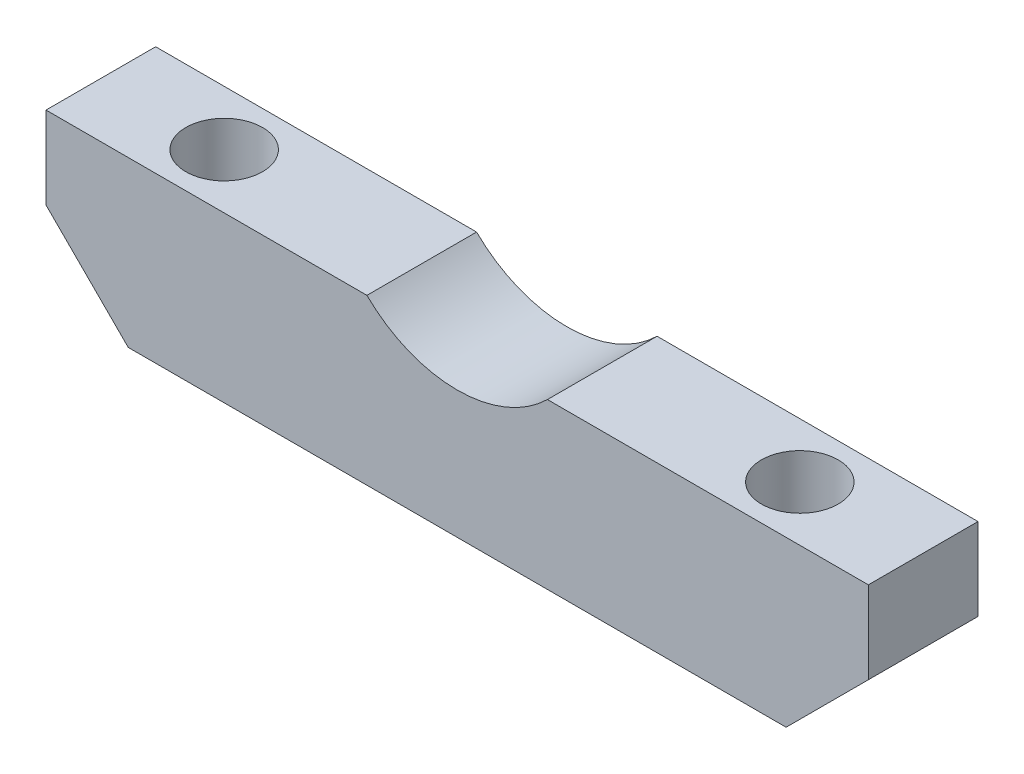
ISO-10303-21;
HEADER;
FILE_DESCRIPTION(('STEP AP214'),'2;1');
FILE_NAME('part.step','',(''),(''),'','','');
FILE_SCHEMA(('AUTOMOTIVE_DESIGN { 1 0 10303 214 1 1 1 1 }'));
ENDSEC;
DATA;
#1=APPLICATION_CONTEXT('core data for automotive mechanical design processes');
#2=APPLICATION_PROTOCOL_DEFINITION('international standard','automotive_design',2000,#1);
#3=PRODUCT_CONTEXT('',#1,'mechanical');
#4=PRODUCT('Part','Part','',(#3));
#5=PRODUCT_RELATED_PRODUCT_CATEGORY('part','',(#4));
#6=PRODUCT_DEFINITION_FORMATION('','',#4);
#7=PRODUCT_DEFINITION_CONTEXT('part definition',#1,'design');
#8=PRODUCT_DEFINITION('design','',#6,#7);
#9=PRODUCT_DEFINITION_SHAPE('','',#8);
#10=(LENGTH_UNIT() NAMED_UNIT(*) SI_UNIT(.MILLI.,.METRE.));
#11=(NAMED_UNIT(*) PLANE_ANGLE_UNIT() SI_UNIT($,.RADIAN.));
#12=(NAMED_UNIT(*) SI_UNIT($,.STERADIAN.) SOLID_ANGLE_UNIT());
#13=UNCERTAINTY_MEASURE_WITH_UNIT(LENGTH_MEASURE(1.E-05),#10,'distance_accuracy_value','');
#14=(GEOMETRIC_REPRESENTATION_CONTEXT(3) GLOBAL_UNCERTAINTY_ASSIGNED_CONTEXT((#13)) GLOBAL_UNIT_ASSIGNED_CONTEXT((#10,
#11,#12)) REPRESENTATION_CONTEXT('',''));
#15=CARTESIAN_POINT('',(0.,0.,0.));
#16=DIRECTION('',(0.,0.,1.));
#17=DIRECTION('',(1.,0.,0.));
#18=AXIS2_PLACEMENT_3D('',#15,#16,#17);
#19=CARTESIAN_POINT('',(-15.,6.5,4.));
#20=DIRECTION('',(0.,-1.,0.));
#21=DIRECTION('',(0.,0.,-1.));
#22=AXIS2_PLACEMENT_3D('',#19,#20,#21);
#23=PLANE('',#22);
#24=CARTESIAN_POINT('',(10.5,6.5,2.));
#25=DIRECTION('',(0.,-1.,0.));
#26=DIRECTION('',(0.,0.,-1.));
#27=AXIS2_PLACEMENT_3D('',#24,#25,#26);
#28=CIRCLE('',#27,1.4);
#29=CARTESIAN_POINT('',(10.5,6.5,0.600000000000001));
#30=VERTEX_POINT('',#29);
#31=EDGE_CURVE('E182',#30,#30,#28,.F.);
#32=ORIENTED_EDGE('',*,*,#31,.F.);
#33=EDGE_LOOP('',(#32));
#34=FACE_BOUND('',#33,.T.);
#35=DIRECTION('',(-1.,0.,0.));
#36=VECTOR('',#35,1.);
#37=CARTESIAN_POINT('',(-15.,6.5,0.));
#38=LINE('',#37,#36);
#39=CARTESIAN_POINT('',(15.,6.5,0.));
#40=VERTEX_POINT('',#39);
#41=CARTESIAN_POINT('',(3.29241552663223,6.5,0.));
#42=VERTEX_POINT('',#41);
#43=EDGE_CURVE('E139',#40,#42,#38,.T.);
#44=ORIENTED_EDGE('',*,*,#43,.T.);
#45=DIRECTION('',(0.,0.,1.));
#46=VECTOR('',#45,1.);
#47=CARTESIAN_POINT('',(3.29241552663223,6.5,-6.));
#48=LINE('',#47,#46);
#49=CARTESIAN_POINT('',(3.29241552663223,6.5,4.));
#50=VERTEX_POINT('',#49);
#51=EDGE_CURVE('E111',#42,#50,#48,.T.);
#52=ORIENTED_EDGE('',*,*,#51,.T.);
#53=DIRECTION('',(-1.,0.,0.));
#54=VECTOR('',#53,1.);
#55=CARTESIAN_POINT('',(-15.,6.5,4.));
#56=LINE('',#55,#54);
#57=CARTESIAN_POINT('',(15.,6.5,4.));
#58=VERTEX_POINT('',#57);
#59=EDGE_CURVE('E121',#58,#50,#56,.T.);
#60=ORIENTED_EDGE('',*,*,#59,.F.);
#61=DIRECTION('',(0.,0.,-1.));
#62=VECTOR('',#61,1.);
#63=CARTESIAN_POINT('',(15.,6.5,4.));
#64=LINE('',#63,#62);
#65=EDGE_CURVE('E144',#58,#40,#64,.T.);
#66=ORIENTED_EDGE('',*,*,#65,.T.);
#67=EDGE_LOOP('',(#44,#52,#60,#66));
#68=FACE_BOUND('',#67,.T.);
#69=ADVANCED_FACE('F34',(#34,#68),#23,.F.);
#70=CARTESIAN_POINT('',(15.,-6.5,4.));
#71=DIRECTION('',(-1.,0.,0.));
#72=DIRECTION('',(0.,0.,1.));
#73=AXIS2_PLACEMENT_3D('',#70,#71,#72);
#74=PLANE('',#73);
#75=DIRECTION('',(0.,1.,0.));
#76=VECTOR('',#75,1.);
#77=CARTESIAN_POINT('',(15.,-6.5,4.));
#78=LINE('',#77,#76);
#79=CARTESIAN_POINT('',(15.,3.50000000000001,4.));
#80=VERTEX_POINT('',#79);
#81=EDGE_CURVE('E128',#80,#58,#78,.T.);
#82=ORIENTED_EDGE('',*,*,#81,.F.);
#83=DIRECTION('',(0.,0.,-1.));
#84=VECTOR('',#83,1.);
#85=CARTESIAN_POINT('',(15.,3.50000000000001,4.));
#86=LINE('',#85,#84);
#87=CARTESIAN_POINT('',(15.,3.50000000000001,0.));
#88=VERTEX_POINT('',#87);
#89=EDGE_CURVE('E57',#80,#88,#86,.T.);
#90=ORIENTED_EDGE('',*,*,#89,.T.);
#91=DIRECTION('',(0.,1.,0.));
#92=VECTOR('',#91,1.);
#93=CARTESIAN_POINT('',(15.,-6.5,0.));
#94=LINE('',#93,#92);
#95=EDGE_CURVE('E136',#88,#40,#94,.T.);
#96=ORIENTED_EDGE('',*,*,#95,.T.);
#97=ORIENTED_EDGE('',*,*,#65,.F.);
#98=EDGE_LOOP('',(#82,#90,#96,#97));
#99=FACE_BOUND('',#98,.T.);
#100=ADVANCED_FACE('F172',(#99),#74,.F.);
#101=CARTESIAN_POINT('',(-10.5,6.5,2.));
#102=DIRECTION('',(0.,-1.,0.));
#103=DIRECTION('',(0.,0.,-1.));
#104=AXIS2_PLACEMENT_3D('',#101,#102,#103);
#105=CIRCLE('',#104,1.4);
#106=CARTESIAN_POINT('',(-10.5,6.5,0.600000000000001));
#107=VERTEX_POINT('',#106);
#108=EDGE_CURVE('E176',#107,#107,#105,.T.);
#109=ORIENTED_EDGE('',*,*,#108,.T.);
#110=EDGE_LOOP('',(#109));
#111=FACE_BOUND('',#110,.T.);
#112=CARTESIAN_POINT('',(-3.29241552662953,6.5,4.));
#113=VERTEX_POINT('',#112);
#114=CARTESIAN_POINT('',(-15.,6.5,4.));
#115=VERTEX_POINT('',#114);
#116=EDGE_CURVE('E118',#113,#115,#56,.T.);
#117=ORIENTED_EDGE('',*,*,#116,.F.);
#118=DIRECTION('',(0.,0.,1.));
#119=VECTOR('',#118,1.);
#120=CARTESIAN_POINT('',(-3.29241552662953,6.5,-6.));
#121=LINE('',#120,#119);
#122=CARTESIAN_POINT('',(-3.29241552662953,6.5,0.));
#123=VERTEX_POINT('',#122);
#124=EDGE_CURVE('E101',#113,#123,#121,.F.);
#125=ORIENTED_EDGE('',*,*,#124,.T.);
#126=CARTESIAN_POINT('',(-15.,6.5,0.));
#127=VERTEX_POINT('',#126);
#128=EDGE_CURVE('E138',#123,#127,#38,.T.);
#129=ORIENTED_EDGE('',*,*,#128,.T.);
#130=DIRECTION('',(0.,0.,-1.));
#131=VECTOR('',#130,1.);
#132=CARTESIAN_POINT('',(-15.,6.5,4.));
#133=LINE('',#132,#131);
#134=EDGE_CURVE('E126',#115,#127,#133,.T.);
#135=ORIENTED_EDGE('',*,*,#134,.F.);
#136=EDGE_LOOP('',(#117,#125,#129,#135));
#137=FACE_BOUND('',#136,.T.);
#138=ADVANCED_FACE('F124',(#111,#137),#23,.F.);
#139=CARTESIAN_POINT('',(-15.,-6.5,4.));
#140=DIRECTION('',(1.,0.,0.));
#141=DIRECTION('',(0.,0.,-1.));
#142=AXIS2_PLACEMENT_3D('',#139,#140,#141);
#143=PLANE('',#142);
#144=DIRECTION('',(0.,-1.,0.));
#145=VECTOR('',#144,1.);
#146=CARTESIAN_POINT('',(-15.,-6.5,0.));
#147=LINE('',#146,#145);
#148=CARTESIAN_POINT('',(-15.,3.49999999999999,0.));
#149=VERTEX_POINT('',#148);
#150=EDGE_CURVE('E131',#127,#149,#147,.T.);
#151=ORIENTED_EDGE('',*,*,#150,.T.);
#152=DIRECTION('',(0.,0.,1.));
#153=VECTOR('',#152,1.);
#154=CARTESIAN_POINT('',(-15.,3.5,4.));
#155=LINE('',#154,#153);
#156=CARTESIAN_POINT('',(-15.,3.49999999999999,4.));
#157=VERTEX_POINT('',#156);
#158=EDGE_CURVE('E11',#149,#157,#155,.T.);
#159=ORIENTED_EDGE('',*,*,#158,.T.);
#160=DIRECTION('',(0.,-1.,0.));
#161=VECTOR('',#160,1.);
#162=CARTESIAN_POINT('',(-15.,-6.5,4.));
#163=LINE('',#162,#161);
#164=EDGE_CURVE('E130',#115,#157,#163,.T.);
#165=ORIENTED_EDGE('',*,*,#164,.F.);
#166=ORIENTED_EDGE('',*,*,#134,.T.);
#167=EDGE_LOOP('',(#151,#159,#165,#166));
#168=FACE_BOUND('',#167,.T.);
#169=ADVANCED_FACE('F206',(#168),#143,.F.);
#170=CARTESIAN_POINT('',(0.,0.,4.));
#171=DIRECTION('',(0.,0.,-1.));
#172=DIRECTION('',(-1.,0.,0.));
#173=AXIS2_PLACEMENT_3D('',#170,#171,#172);
#174=PLANE('',#173);
#175=DIRECTION('',(-1.,0.,0.));
#176=VECTOR('',#175,1.);
#177=CARTESIAN_POINT('',(-15.,0.5,4.));
#178=LINE('',#177,#176);
#179=CARTESIAN_POINT('',(12.,0.5,4.));
#180=VERTEX_POINT('',#179);
#181=CARTESIAN_POINT('',(-12.,0.5,4.));
#182=VERTEX_POINT('',#181);
#183=EDGE_CURVE('E122',#180,#182,#178,.T.);
#184=ORIENTED_EDGE('',*,*,#183,.F.);
#185=DIRECTION('',(-0.707106781186546,-0.707106781186549,0.));
#186=VECTOR('',#185,1.);
#187=CARTESIAN_POINT('',(12.,0.5,4.));
#188=LINE('',#187,#186);
#189=EDGE_CURVE('E158',#180,#80,#188,.F.);
#190=ORIENTED_EDGE('',*,*,#189,.T.);
#191=ORIENTED_EDGE('',*,*,#81,.T.);
#192=ORIENTED_EDGE('',*,*,#59,.T.);
#193=CARTESIAN_POINT('',(1.34961486430996E-12,9.85410196624967,4.));
#194=DIRECTION('',(0.,0.,1.));
#195=DIRECTION('',(1.,0.,0.));
#196=AXIS2_PLACEMENT_3D('',#193,#194,#195);
#197=CIRCLE('',#196,4.7);
#198=EDGE_CURVE('E104',#113,#50,#197,.T.);
#199=ORIENTED_EDGE('',*,*,#198,.F.);
#200=ORIENTED_EDGE('',*,*,#116,.T.);
#201=ORIENTED_EDGE('',*,*,#164,.T.);
#202=DIRECTION('',(-0.707106781186549,0.707106781186546,0.));
#203=VECTOR('',#202,1.);
#204=CARTESIAN_POINT('',(-15.,3.5,4.));
#205=LINE('',#204,#203);
#206=EDGE_CURVE('E156',#157,#182,#205,.F.);
#207=ORIENTED_EDGE('',*,*,#206,.T.);
#208=EDGE_LOOP('',(#184,#190,#191,#192,#199,#200,#201,#207));
#209=FACE_BOUND('',#208,.T.);
#210=ADVANCED_FACE('F116',(#209),#174,.F.);
#211=CARTESIAN_POINT('',(0.,0.,0.));
#212=DIRECTION('',(0.,0.,-1.));
#213=DIRECTION('',(-1.,0.,0.));
#214=AXIS2_PLACEMENT_3D('',#211,#212,#213);
#215=PLANE('',#214);
#216=ORIENTED_EDGE('',*,*,#95,.F.);
#217=DIRECTION('',(0.707106781186546,0.707106781186549,0.));
#218=VECTOR('',#217,1.);
#219=CARTESIAN_POINT('',(5.75000000000002,-5.75,0.));
#220=LINE('',#219,#218);
#221=CARTESIAN_POINT('',(12.,0.5,0.));
#222=VERTEX_POINT('',#221);
#223=EDGE_CURVE('E42',#88,#222,#220,.F.);
#224=ORIENTED_EDGE('',*,*,#223,.T.);
#225=DIRECTION('',(1.,0.,0.));
#226=VECTOR('',#225,1.);
#227=CARTESIAN_POINT('',(0.,0.5,0.));
#228=LINE('',#227,#226);
#229=CARTESIAN_POINT('',(-12.,0.5,0.));
#230=VERTEX_POINT('',#229);
#231=EDGE_CURVE('E148',#230,#222,#228,.T.);
#232=ORIENTED_EDGE('',*,*,#231,.F.);
#233=DIRECTION('',(0.707106781186549,-0.707106781186546,0.));
#234=VECTOR('',#233,1.);
#235=CARTESIAN_POINT('',(-5.74999999999997,-5.74999999999999,0.));
#236=LINE('',#235,#234);
#237=EDGE_CURVE('E49',#230,#149,#236,.F.);
#238=ORIENTED_EDGE('',*,*,#237,.T.);
#239=ORIENTED_EDGE('',*,*,#150,.F.);
#240=ORIENTED_EDGE('',*,*,#128,.F.);
#241=CARTESIAN_POINT('',(1.34961486430996E-12,9.85410196624967,0.));
#242=DIRECTION('',(0.,0.,-1.));
#243=DIRECTION('',(-1.,0.,0.));
#244=AXIS2_PLACEMENT_3D('',#241,#242,#243);
#245=CIRCLE('',#244,4.7);
#246=EDGE_CURVE('E107',#42,#123,#245,.T.);
#247=ORIENTED_EDGE('',*,*,#246,.F.);
#248=ORIENTED_EDGE('',*,*,#43,.F.);
#249=EDGE_LOOP('',(#216,#224,#232,#238,#239,#240,#247,#248));
#250=FACE_BOUND('',#249,.T.);
#251=ADVANCED_FACE('F162',(#250),#215,.T.);
#252=CARTESIAN_POINT('',(1.34961486430996E-12,9.85410196624967,-6.));
#253=DIRECTION('',(0.,0.,1.));
#254=DIRECTION('',(1.,0.,0.));
#255=AXIS2_PLACEMENT_3D('',#252,#253,#254);
#256=CYLINDRICAL_SURFACE('',#255,4.7);
#257=ORIENTED_EDGE('',*,*,#246,.T.);
#258=ORIENTED_EDGE('',*,*,#124,.F.);
#259=ORIENTED_EDGE('',*,*,#198,.T.);
#260=ORIENTED_EDGE('',*,*,#51,.F.);
#261=EDGE_LOOP('',(#257,#258,#259,#260));
#262=FACE_BOUND('',#261,.T.);
#263=ADVANCED_FACE('F103',(#262),#256,.F.);
#264=CARTESIAN_POINT('',(-15.,0.5,-6.));
#265=DIRECTION('',(0.,1.,0.));
#266=DIRECTION('',(0.,0.,1.));
#267=AXIS2_PLACEMENT_3D('',#264,#265,#266);
#268=PLANE('',#267);
#269=CARTESIAN_POINT('',(10.5,0.5,2.));
#270=DIRECTION('',(0.,1.,0.));
#271=DIRECTION('',(0.,0.,-1.));
#272=AXIS2_PLACEMENT_3D('',#269,#270,#271);
#273=CIRCLE('',#272,1.4);
#274=CARTESIAN_POINT('',(10.5,0.5,0.600000000000001));
#275=VERTEX_POINT('',#274);
#276=EDGE_CURVE('E185',#275,#275,#273,.T.);
#277=ORIENTED_EDGE('',*,*,#276,.T.);
#278=EDGE_LOOP('',(#277));
#279=FACE_BOUND('',#278,.T.);
#280=CARTESIAN_POINT('',(-10.5,0.5,2.));
#281=DIRECTION('',(0.,-1.,0.));
#282=DIRECTION('',(0.,0.,-1.));
#283=AXIS2_PLACEMENT_3D('',#280,#281,#282);
#284=CIRCLE('',#283,1.4);
#285=CARTESIAN_POINT('',(-10.5,0.5,0.600000000000001));
#286=VERTEX_POINT('',#285);
#287=EDGE_CURVE('E179',#286,#286,#284,.T.);
#288=ORIENTED_EDGE('',*,*,#287,.F.);
#289=EDGE_LOOP('',(#288));
#290=FACE_BOUND('',#289,.T.);
#291=ORIENTED_EDGE('',*,*,#231,.T.);
#292=DIRECTION('',(0.,0.,1.));
#293=VECTOR('',#292,1.);
#294=CARTESIAN_POINT('',(12.,0.5,-6.));
#295=LINE('',#294,#293);
#296=EDGE_CURVE('E153',#222,#180,#295,.T.);
#297=ORIENTED_EDGE('',*,*,#296,.T.);
#298=ORIENTED_EDGE('',*,*,#183,.T.);
#299=DIRECTION('',(0.,0.,-1.));
#300=VECTOR('',#299,1.);
#301=CARTESIAN_POINT('',(-12.,0.5,-6.));
#302=LINE('',#301,#300);
#303=EDGE_CURVE('E151',#182,#230,#302,.T.);
#304=ORIENTED_EDGE('',*,*,#303,.T.);
#305=EDGE_LOOP('',(#291,#297,#298,#304));
#306=FACE_BOUND('',#305,.T.);
#307=ADVANCED_FACE('F167',(#279,#290,#306),#268,.F.);
#308=CARTESIAN_POINT('',(12.,0.5,-6.));
#309=DIRECTION('',(-0.707106781186549,0.707106781186546,0.));
#310=DIRECTION('',(0.,0.,1.));
#311=AXIS2_PLACEMENT_3D('',#308,#309,#310);
#312=PLANE('',#311);
#313=ORIENTED_EDGE('',*,*,#223,.F.);
#314=ORIENTED_EDGE('',*,*,#89,.F.);
#315=ORIENTED_EDGE('',*,*,#189,.F.);
#316=ORIENTED_EDGE('',*,*,#296,.F.);
#317=EDGE_LOOP('',(#313,#314,#315,#316));
#318=FACE_BOUND('',#317,.T.);
#319=ADVANCED_FACE('F170',(#318),#312,.F.);
#320=CARTESIAN_POINT('',(-15.,3.5,4.));
#321=DIRECTION('',(0.707106781186546,0.707106781186549,0.));
#322=DIRECTION('',(0.,0.,1.));
#323=AXIS2_PLACEMENT_3D('',#320,#321,#322);
#324=PLANE('',#323);
#325=ORIENTED_EDGE('',*,*,#237,.F.);
#326=ORIENTED_EDGE('',*,*,#303,.F.);
#327=ORIENTED_EDGE('',*,*,#206,.F.);
#328=ORIENTED_EDGE('',*,*,#158,.F.);
#329=EDGE_LOOP('',(#325,#326,#327,#328));
#330=FACE_BOUND('',#329,.T.);
#331=ADVANCED_FACE('F36',(#330),#324,.F.);
#332=CARTESIAN_POINT('',(-10.5,10.5,2.));
#333=DIRECTION('',(0.,-1.,0.));
#334=DIRECTION('',(0.,0.,-1.));
#335=AXIS2_PLACEMENT_3D('',#332,#333,#334);
#336=CYLINDRICAL_SURFACE('',#335,1.4);
#337=ORIENTED_EDGE('',*,*,#287,.T.);
#338=EDGE_LOOP('',(#337));
#339=FACE_BOUND('',#338,.T.);
#340=ORIENTED_EDGE('',*,*,#108,.F.);
#341=EDGE_LOOP('',(#340));
#342=FACE_BOUND('',#341,.T.);
#343=ADVANCED_FACE('F194',(#339,#342),#336,.F.);
#344=CARTESIAN_POINT('',(10.5,10.5,2.));
#345=DIRECTION('',(0.,-1.,0.));
#346=DIRECTION('',(0.,0.,-1.));
#347=AXIS2_PLACEMENT_3D('',#344,#345,#346);
#348=CYLINDRICAL_SURFACE('',#347,1.4);
#349=ORIENTED_EDGE('',*,*,#276,.F.);
#350=EDGE_LOOP('',(#349));
#351=FACE_BOUND('',#350,.T.);
#352=ORIENTED_EDGE('',*,*,#31,.T.);
#353=EDGE_LOOP('',(#352));
#354=FACE_BOUND('',#353,.T.);
#355=ADVANCED_FACE('F191',(#351,#354),#348,.F.);
#356=CLOSED_SHELL('',(#69,#100,#138,#169,#210,#251,#263,#307,#319,#331,#343,#355));
#357=MANIFOLD_SOLID_BREP('B2',#356);
#358=ADVANCED_BREP_SHAPE_REPRESENTATION('',(#18,#357),#14);
#359=SHAPE_DEFINITION_REPRESENTATION(#9,#358);
ENDSEC;
END-ISO-10303-21;
